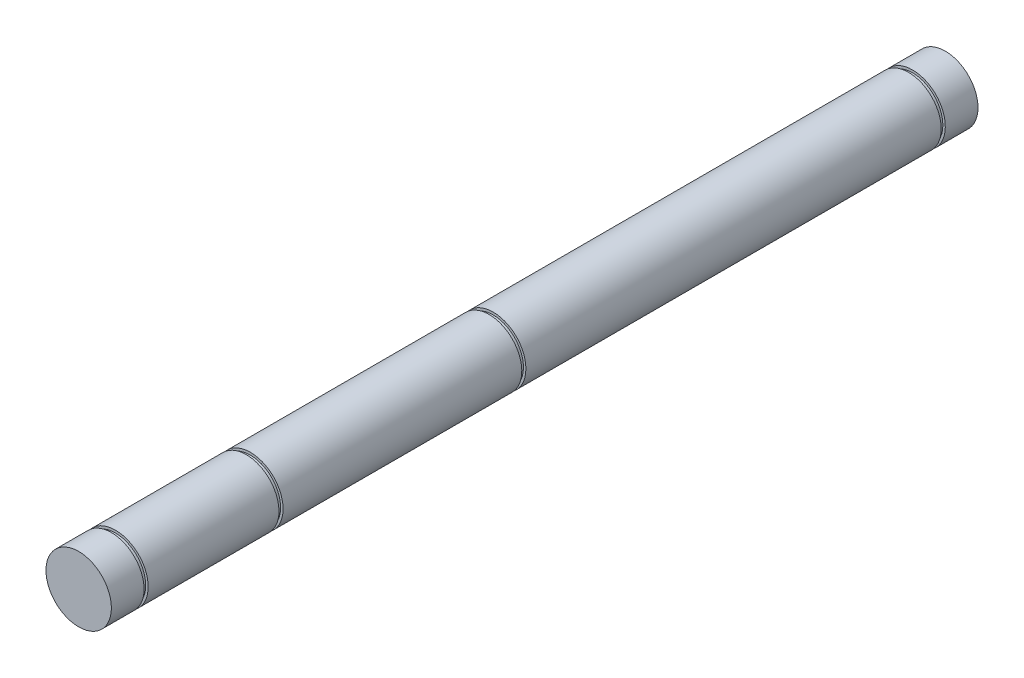
ISO-10303-21;
HEADER;
FILE_DESCRIPTION(('STEP AP214'),'2;1');
FILE_NAME('part.step','',(''),(''),'','','');
FILE_SCHEMA(('AUTOMOTIVE_DESIGN { 1 0 10303 214 1 1 1 1 }'));
ENDSEC;
DATA;
#1=APPLICATION_CONTEXT('core data for automotive mechanical design processes');
#2=APPLICATION_PROTOCOL_DEFINITION('international standard','automotive_design',2000,#1);
#3=PRODUCT_CONTEXT('',#1,'mechanical');
#4=PRODUCT('Part','Part','',(#3));
#5=PRODUCT_RELATED_PRODUCT_CATEGORY('part','',(#4));
#6=PRODUCT_DEFINITION_FORMATION('','',#4);
#7=PRODUCT_DEFINITION_CONTEXT('part definition',#1,'design');
#8=PRODUCT_DEFINITION('design','',#6,#7);
#9=PRODUCT_DEFINITION_SHAPE('','',#8);
#10=(LENGTH_UNIT() NAMED_UNIT(*) SI_UNIT(.MILLI.,.METRE.));
#11=(NAMED_UNIT(*) PLANE_ANGLE_UNIT() SI_UNIT($,.RADIAN.));
#12=(NAMED_UNIT(*) SI_UNIT($,.STERADIAN.) SOLID_ANGLE_UNIT());
#13=UNCERTAINTY_MEASURE_WITH_UNIT(LENGTH_MEASURE(1.E-05),#10,'distance_accuracy_value','');
#14=(GEOMETRIC_REPRESENTATION_CONTEXT(3) GLOBAL_UNCERTAINTY_ASSIGNED_CONTEXT((#13)) GLOBAL_UNIT_ASSIGNED_CONTEXT((#10,
#11,#12)) REPRESENTATION_CONTEXT('',''));
#15=CARTESIAN_POINT('',(0.,0.,0.));
#16=DIRECTION('',(0.,0.,1.));
#17=DIRECTION('',(1.,0.,0.));
#18=AXIS2_PLACEMENT_3D('',#15,#16,#17);
#19=CARTESIAN_POINT('',(7.32747196252603E-12,3.10862446895044E-12,53.0000000000001));
#20=DIRECTION('',(0.,0.,-1.));
#21=DIRECTION('',(-1.00000000000002,0.,0.));
#22=AXIS2_PLACEMENT_3D('',#19,#20,#21);
#23=CYLINDRICAL_SURFACE('',#22,2.);
#24=CARTESIAN_POINT('',(0.,0.,2.00000000000009));
#25=DIRECTION('',(0.,0.,-1.));
#26=DIRECTION('',(0.,1.00000000000002,0.));
#27=AXIS2_PLACEMENT_3D('',#24,#25,#26);
#28=CIRCLE('',#27,2.);
#29=CARTESIAN_POINT('',(0.,2.00000000000004,2.00000000000008));
#30=VERTEX_POINT('',#29);
#31=EDGE_CURVE('E36',#30,#30,#28,.T.);
#32=ORIENTED_EDGE('',*,*,#31,.T.);
#33=EDGE_LOOP('',(#32));
#34=FACE_BOUND('',#33,.T.);
#35=CARTESIAN_POINT('',(0.,0.,0.));
#36=DIRECTION('',(0.,0.,1.));
#37=DIRECTION('',(1.00000000000002,0.,0.));
#38=AXIS2_PLACEMENT_3D('',#35,#36,#37);
#39=CIRCLE('',#38,2.);
#40=CARTESIAN_POINT('',(2.00000000000004,0.,0.));
#41=VERTEX_POINT('',#40);
#42=EDGE_CURVE('E40',#41,#41,#39,.T.);
#43=ORIENTED_EDGE('',*,*,#42,.T.);
#44=EDGE_LOOP('',(#43));
#45=FACE_BOUND('',#44,.T.);
#46=ADVANCED_FACE('F32',(#34,#45),#23,.T.);
#47=CARTESIAN_POINT('',(0.,0.,0.));
#48=DIRECTION('',(0.,0.,1.));
#49=DIRECTION('',(1.00000000000002,0.,0.));
#50=AXIS2_PLACEMENT_3D('',#47,#48,#49);
#51=PLANE('',#50);
#52=ORIENTED_EDGE('',*,*,#42,.F.);
#53=EDGE_LOOP('',(#52));
#54=FACE_BOUND('',#53,.T.);
#55=ADVANCED_FACE('F80',(#54),#51,.F.);
#56=CARTESIAN_POINT('',(2.22044604925031E-12,3.8500000000028,2.00000000000014));
#57=DIRECTION('',(0.,0.,-1.));
#58=DIRECTION('',(0.,1.00000000000002,0.));
#59=AXIS2_PLACEMENT_3D('',#56,#57,#58);
#60=PLANE('',#59);
#61=CARTESIAN_POINT('',(0.,0.,2.00000000000009));
#62=DIRECTION('',(0.,0.,-1.));
#63=DIRECTION('',(0.,1.00000000000002,0.));
#64=AXIS2_PLACEMENT_3D('',#61,#62,#63);
#65=CIRCLE('',#64,1.84999999999999);
#66=CARTESIAN_POINT('',(0.,1.85000000000003,2.00000000000008));
#67=VERTEX_POINT('',#66);
#68=EDGE_CURVE('E54',#67,#67,#65,.T.);
#69=ORIENTED_EDGE('',*,*,#68,.T.);
#70=EDGE_LOOP('',(#69));
#71=FACE_BOUND('',#70,.T.);
#72=ORIENTED_EDGE('',*,*,#31,.F.);
#73=EDGE_LOOP('',(#72));
#74=FACE_BOUND('',#73,.T.);
#75=ADVANCED_FACE('F77',(#71,#74),#60,.F.);
#76=CARTESIAN_POINT('',(2.22044604925031E-12,3.8500000000028,2.25000000000017));
#77=DIRECTION('',(0.,0.,1.));
#78=DIRECTION('',(0.,-1.00000000000002,0.));
#79=AXIS2_PLACEMENT_3D('',#76,#77,#78);
#80=PLANE('',#79);
#81=CARTESIAN_POINT('',(0.,0.,2.25000000000011));
#82=DIRECTION('',(0.,0.,-1.));
#83=DIRECTION('',(0.,1.00000000000002,0.));
#84=AXIS2_PLACEMENT_3D('',#81,#82,#83);
#85=CIRCLE('',#84,1.84999999999999);
#86=CARTESIAN_POINT('',(0.,1.85000000000003,2.25000000000011));
#87=VERTEX_POINT('',#86);
#88=EDGE_CURVE('E181',#87,#87,#85,.T.);
#89=ORIENTED_EDGE('',*,*,#88,.F.);
#90=EDGE_LOOP('',(#89));
#91=FACE_BOUND('',#90,.T.);
#92=CARTESIAN_POINT('',(0.,0.,2.25000000000011));
#93=DIRECTION('',(0.,0.,1.));
#94=DIRECTION('',(0.,-1.00000000000002,0.));
#95=AXIS2_PLACEMENT_3D('',#92,#93,#94);
#96=CIRCLE('',#95,2.);
#97=CARTESIAN_POINT('',(0.,-2.00000000000004,2.25000000000011));
#98=VERTEX_POINT('',#97);
#99=EDGE_CURVE('E68',#98,#98,#96,.T.);
#100=ORIENTED_EDGE('',*,*,#99,.F.);
#101=EDGE_LOOP('',(#100));
#102=FACE_BOUND('',#101,.T.);
#103=ADVANCED_FACE('F79',(#91,#102),#80,.F.);
#104=CARTESIAN_POINT('',(0.,0.,0.));
#105=DIRECTION('',(0.,0.,-1.));
#106=DIRECTION('',(0.,1.00000000000002,0.));
#107=AXIS2_PLACEMENT_3D('',#104,#105,#106);
#108=CYLINDRICAL_SURFACE('',#107,1.84999999999999);
#109=ORIENTED_EDGE('',*,*,#68,.F.);
#110=EDGE_LOOP('',(#109));
#111=FACE_BOUND('',#110,.T.);
#112=ORIENTED_EDGE('',*,*,#88,.T.);
#113=EDGE_LOOP('',(#112));
#114=FACE_BOUND('',#113,.T.);
#115=ADVANCED_FACE('F87',(#111,#114),#108,.T.);
#116=ORIENTED_EDGE('',*,*,#99,.T.);
#117=EDGE_LOOP('',(#116));
#118=FACE_BOUND('',#117,.T.);
#119=CARTESIAN_POINT('',(0.,0.,27.6500000000001));
#120=DIRECTION('',(0.,0.,-1.));
#121=DIRECTION('',(0.,1.00000000000002,0.));
#122=AXIS2_PLACEMENT_3D('',#119,#120,#121);
#123=CIRCLE('',#122,2.);
#124=CARTESIAN_POINT('',(0.,2.00000000000004,27.6500000000001));
#125=VERTEX_POINT('',#124);
#126=EDGE_CURVE('E57',#125,#125,#123,.T.);
#127=ORIENTED_EDGE('',*,*,#126,.T.);
#128=EDGE_LOOP('',(#127));
#129=FACE_BOUND('',#128,.T.);
#130=ADVANCED_FACE('F106',(#118,#129),#23,.T.);
#131=CARTESIAN_POINT('',(1.33226762955019E-12,3.85000000000207,27.9000000000001));
#132=DIRECTION('',(0.,0.,1.));
#133=DIRECTION('',(0.,-1.00000000000002,0.));
#134=AXIS2_PLACEMENT_3D('',#131,#132,#133);
#135=PLANE('',#134);
#136=CARTESIAN_POINT('',(0.,0.,27.9000000000001));
#137=DIRECTION('',(0.,0.,-1.));
#138=DIRECTION('',(0.,1.00000000000002,0.));
#139=AXIS2_PLACEMENT_3D('',#136,#137,#138);
#140=CIRCLE('',#139,1.84999999999995);
#141=CARTESIAN_POINT('',(0.,1.84999999999999,27.9000000000001));
#142=VERTEX_POINT('',#141);
#143=EDGE_CURVE('E47',#142,#142,#140,.T.);
#144=ORIENTED_EDGE('',*,*,#143,.F.);
#145=EDGE_LOOP('',(#144));
#146=FACE_BOUND('',#145,.T.);
#147=CARTESIAN_POINT('',(0.,0.,27.9000000000001));
#148=DIRECTION('',(0.,0.,1.));
#149=DIRECTION('',(0.,-1.00000000000002,0.));
#150=AXIS2_PLACEMENT_3D('',#147,#148,#149);
#151=CIRCLE('',#150,2.);
#152=CARTESIAN_POINT('',(0.,-2.00000000000004,27.9000000000001));
#153=VERTEX_POINT('',#152);
#154=EDGE_CURVE('E60',#153,#153,#151,.T.);
#155=ORIENTED_EDGE('',*,*,#154,.F.);
#156=EDGE_LOOP('',(#155));
#157=FACE_BOUND('',#156,.T.);
#158=ADVANCED_FACE('F114',(#146,#157),#135,.F.);
#159=CARTESIAN_POINT('',(1.33226762955019E-12,3.85000000000207,27.6500000000001));
#160=DIRECTION('',(0.,0.,-1.));
#161=DIRECTION('',(0.,1.00000000000002,0.));
#162=AXIS2_PLACEMENT_3D('',#159,#160,#161);
#163=PLANE('',#162);
#164=CARTESIAN_POINT('',(0.,0.,27.6500000000001));
#165=DIRECTION('',(0.,0.,-1.));
#166=DIRECTION('',(0.,1.00000000000002,0.));
#167=AXIS2_PLACEMENT_3D('',#164,#165,#166);
#168=CIRCLE('',#167,1.84999999999995);
#169=CARTESIAN_POINT('',(0.,1.84999999999999,27.6500000000001));
#170=VERTEX_POINT('',#169);
#171=EDGE_CURVE('E168',#170,#170,#168,.T.);
#172=ORIENTED_EDGE('',*,*,#171,.T.);
#173=EDGE_LOOP('',(#172));
#174=FACE_BOUND('',#173,.T.);
#175=ORIENTED_EDGE('',*,*,#126,.F.);
#176=EDGE_LOOP('',(#175));
#177=FACE_BOUND('',#176,.T.);
#178=ADVANCED_FACE('F119',(#174,#177),#163,.F.);
#179=CARTESIAN_POINT('',(0.,0.,0.));
#180=DIRECTION('',(0.,0.,-1.));
#181=DIRECTION('',(0.,1.00000000000002,0.));
#182=AXIS2_PLACEMENT_3D('',#179,#180,#181);
#183=CYLINDRICAL_SURFACE('',#182,1.84999999999995);
#184=ORIENTED_EDGE('',*,*,#171,.F.);
#185=EDGE_LOOP('',(#184));
#186=FACE_BOUND('',#185,.T.);
#187=ORIENTED_EDGE('',*,*,#143,.T.);
#188=EDGE_LOOP('',(#187));
#189=FACE_BOUND('',#188,.T.);
#190=ADVANCED_FACE('F100',(#186,#189),#183,.T.);
#191=CARTESIAN_POINT('',(5.99520433297585E-12,1.77635683940025E-12,42.5000000000001));
#192=DIRECTION('',(0.,0.,-1.));
#193=DIRECTION('',(0.,1.00000000000002,0.));
#194=AXIS2_PLACEMENT_3D('',#191,#192,#193);
#195=CIRCLE('',#194,2.);
#196=CARTESIAN_POINT('',(5.99487126606846E-12,2.00000000000181,42.5000000000001));
#197=VERTEX_POINT('',#196);
#198=EDGE_CURVE('E66',#197,#197,#195,.T.);
#199=ORIENTED_EDGE('',*,*,#198,.T.);
#200=EDGE_LOOP('',(#199));
#201=FACE_BOUND('',#200,.T.);
#202=ORIENTED_EDGE('',*,*,#154,.T.);
#203=EDGE_LOOP('',(#202));
#204=FACE_BOUND('',#203,.T.);
#205=ADVANCED_FACE('F95',(#201,#204),#23,.T.);
#206=CARTESIAN_POINT('',(5.21804821573824E-12,3.85000000000185,42.5000000000001));
#207=DIRECTION('',(0.,0.,-1.));
#208=DIRECTION('',(0.,1.00000000000002,0.));
#209=AXIS2_PLACEMENT_3D('',#206,#207,#208);
#210=PLANE('',#209);
#211=CARTESIAN_POINT('',(5.99520433297585E-12,1.77635683940025E-12,42.5000000000001));
#212=DIRECTION('',(0.,0.,-1.));
#213=DIRECTION('',(0.,1.00000000000002,0.));
#214=AXIS2_PLACEMENT_3D('',#211,#212,#213);
#215=CIRCLE('',#214,1.84999999999998);
#216=CARTESIAN_POINT('',(5.99489624608651E-12,1.85000000000179,42.5000000000001));
#217=VERTEX_POINT('',#216);
#218=EDGE_CURVE('E175',#217,#217,#215,.T.);
#219=ORIENTED_EDGE('',*,*,#218,.T.);
#220=EDGE_LOOP('',(#219));
#221=FACE_BOUND('',#220,.T.);
#222=ORIENTED_EDGE('',*,*,#198,.F.);
#223=EDGE_LOOP('',(#222));
#224=FACE_BOUND('',#223,.T.);
#225=ADVANCED_FACE('F99',(#221,#224),#210,.F.);
#226=CARTESIAN_POINT('',(5.21804821573824E-12,3.85000000000185,42.7500000000001));
#227=DIRECTION('',(0.,0.,1.));
#228=DIRECTION('',(0.,-1.00000000000002,0.));
#229=AXIS2_PLACEMENT_3D('',#226,#227,#228);
#230=PLANE('',#229);
#231=CARTESIAN_POINT('',(5.99520433297585E-12,1.77635683940025E-12,42.7500000000001));
#232=DIRECTION('',(0.,0.,-1.));
#233=DIRECTION('',(0.,1.00000000000002,0.));
#234=AXIS2_PLACEMENT_3D('',#231,#232,#233);
#235=CIRCLE('',#234,1.84999999999998);
#236=CARTESIAN_POINT('',(5.99489624608651E-12,1.85000000000179,42.7500000000001));
#237=VERTEX_POINT('',#236);
#238=EDGE_CURVE('E177',#237,#237,#235,.T.);
#239=ORIENTED_EDGE('',*,*,#238,.F.);
#240=EDGE_LOOP('',(#239));
#241=FACE_BOUND('',#240,.T.);
#242=CARTESIAN_POINT('',(5.99520433297585E-12,1.77635683940025E-12,42.7500000000001));
#243=DIRECTION('',(0.,0.,1.));
#244=DIRECTION('',(0.,-1.00000000000002,0.));
#245=AXIS2_PLACEMENT_3D('',#242,#243,#244);
#246=CIRCLE('',#245,2.);
#247=CARTESIAN_POINT('',(5.99553739988323E-12,-1.99999999999826,42.7500000000001));
#248=VERTEX_POINT('',#247);
#249=EDGE_CURVE('E63',#248,#248,#246,.T.);
#250=ORIENTED_EDGE('',*,*,#249,.F.);
#251=EDGE_LOOP('',(#250));
#252=FACE_BOUND('',#251,.T.);
#253=ADVANCED_FACE('F135',(#241,#252),#230,.F.);
#254=CARTESIAN_POINT('',(0.,0.,0.));
#255=DIRECTION('',(0.,0.,-1.));
#256=DIRECTION('',(0.,1.00000000000002,0.));
#257=AXIS2_PLACEMENT_3D('',#254,#255,#256);
#258=CYLINDRICAL_SURFACE('',#257,1.84999999999998);
#259=ORIENTED_EDGE('',*,*,#218,.F.);
#260=EDGE_LOOP('',(#259));
#261=FACE_BOUND('',#260,.T.);
#262=ORIENTED_EDGE('',*,*,#238,.T.);
#263=EDGE_LOOP('',(#262));
#264=FACE_BOUND('',#263,.T.);
#265=ADVANCED_FACE('F126',(#261,#264),#258,.T.);
#266=ORIENTED_EDGE('',*,*,#249,.T.);
#267=EDGE_LOOP('',(#266));
#268=FACE_BOUND('',#267,.T.);
#269=CARTESIAN_POINT('',(7.32747196252603E-12,3.10862446895044E-12,50.7500000000001));
#270=DIRECTION('',(0.,0.,-1.));
#271=DIRECTION('',(0.,1.00000000000002,0.));
#272=AXIS2_PLACEMENT_3D('',#269,#270,#271);
#273=CIRCLE('',#272,2.);
#274=CARTESIAN_POINT('',(7.32713889561865E-12,2.00000000000315,50.7500000000001));
#275=VERTEX_POINT('',#274);
#276=EDGE_CURVE('E53',#275,#275,#273,.T.);
#277=ORIENTED_EDGE('',*,*,#276,.T.);
#278=EDGE_LOOP('',(#277));
#279=FACE_BOUND('',#278,.T.);
#280=ADVANCED_FACE('F102',(#268,#279),#23,.T.);
#281=CARTESIAN_POINT('',(5.55111512312578E-12,3.85000000000291,50.7500000000001));
#282=DIRECTION('',(0.,0.,-1.));
#283=DIRECTION('',(0.,1.00000000000002,0.));
#284=AXIS2_PLACEMENT_3D('',#281,#282,#283);
#285=PLANE('',#284);
#286=CARTESIAN_POINT('',(7.32747196252603E-12,3.10862446895044E-12,50.7500000000001));
#287=DIRECTION('',(0.,0.,-1.));
#288=DIRECTION('',(0.,1.00000000000002,0.));
#289=AXIS2_PLACEMENT_3D('',#286,#287,#288);
#290=CIRCLE('',#289,1.84999999999998);
#291=CARTESIAN_POINT('',(7.3271638756367E-12,1.85000000000312,50.7500000000001));
#292=VERTEX_POINT('',#291);
#293=EDGE_CURVE('E173',#292,#292,#290,.T.);
#294=ORIENTED_EDGE('',*,*,#293,.T.);
#295=EDGE_LOOP('',(#294));
#296=FACE_BOUND('',#295,.T.);
#297=ORIENTED_EDGE('',*,*,#276,.F.);
#298=EDGE_LOOP('',(#297));
#299=FACE_BOUND('',#298,.T.);
#300=ADVANCED_FACE('F125',(#296,#299),#285,.F.);
#301=CARTESIAN_POINT('',(5.55111512312578E-12,3.85000000000291,51.0000000000001));
#302=DIRECTION('',(0.,0.,1.));
#303=DIRECTION('',(0.,-1.00000000000002,0.));
#304=AXIS2_PLACEMENT_3D('',#301,#302,#303);
#305=PLANE('',#304);
#306=CARTESIAN_POINT('',(7.32747196252603E-12,3.10862446895044E-12,51.0000000000001));
#307=DIRECTION('',(0.,0.,-1.));
#308=DIRECTION('',(0.,1.00000000000002,0.));
#309=AXIS2_PLACEMENT_3D('',#306,#307,#308);
#310=CIRCLE('',#309,1.84999999999998);
#311=CARTESIAN_POINT('',(7.3271638756367E-12,1.85000000000312,51.0000000000001));
#312=VERTEX_POINT('',#311);
#313=EDGE_CURVE('E171',#312,#312,#310,.T.);
#314=ORIENTED_EDGE('',*,*,#313,.F.);
#315=EDGE_LOOP('',(#314));
#316=FACE_BOUND('',#315,.T.);
#317=CARTESIAN_POINT('',(7.32747196252603E-12,3.10862446895044E-12,51.0000000000001));
#318=DIRECTION('',(0.,0.,1.));
#319=DIRECTION('',(0.,-1.00000000000002,0.));
#320=AXIS2_PLACEMENT_3D('',#317,#318,#319);
#321=CIRCLE('',#320,2.);
#322=CARTESIAN_POINT('',(7.32780502943342E-12,-1.99999999999693,51.0000000000001));
#323=VERTEX_POINT('',#322);
#324=EDGE_CURVE('E50',#323,#323,#321,.T.);
#325=ORIENTED_EDGE('',*,*,#324,.F.);
#326=EDGE_LOOP('',(#325));
#327=FACE_BOUND('',#326,.T.);
#328=ADVANCED_FACE('F132',(#316,#327),#305,.F.);
#329=CARTESIAN_POINT('',(0.,0.,0.));
#330=DIRECTION('',(0.,0.,-1.));
#331=DIRECTION('',(0.,1.00000000000002,0.));
#332=AXIS2_PLACEMENT_3D('',#329,#330,#331);
#333=CYLINDRICAL_SURFACE('',#332,1.84999999999998);
#334=ORIENTED_EDGE('',*,*,#293,.F.);
#335=EDGE_LOOP('',(#334));
#336=FACE_BOUND('',#335,.T.);
#337=ORIENTED_EDGE('',*,*,#313,.T.);
#338=EDGE_LOOP('',(#337));
#339=FACE_BOUND('',#338,.T.);
#340=ADVANCED_FACE('F110',(#336,#339),#333,.T.);
#341=CARTESIAN_POINT('',(7.32747196252603E-12,3.10862446895044E-12,53.0000000000001));
#342=DIRECTION('',(0.,0.,1.));
#343=DIRECTION('',(1.00000000000002,0.,0.));
#344=AXIS2_PLACEMENT_3D('',#341,#342,#343);
#345=PLANE('',#344);
#346=CARTESIAN_POINT('',(7.32747196252603E-12,3.10862446895044E-12,53.0000000000001));
#347=DIRECTION('',(0.,0.,1.));
#348=DIRECTION('',(1.00000000000002,0.,0.));
#349=AXIS2_PLACEMENT_3D('',#346,#347,#348);
#350=CIRCLE('',#349,2.);
#351=CARTESIAN_POINT('',(2.00000000000737,3.10895753585783E-12,53.0000000000001));
#352=VERTEX_POINT('',#351);
#353=EDGE_CURVE('E10',#352,#352,#350,.T.);
#354=ORIENTED_EDGE('',*,*,#353,.T.);
#355=EDGE_LOOP('',(#354));
#356=FACE_BOUND('',#355,.T.);
#357=ADVANCED_FACE('F104',(#356),#345,.T.);
#358=ORIENTED_EDGE('',*,*,#324,.T.);
#359=EDGE_LOOP('',(#358));
#360=FACE_BOUND('',#359,.T.);
#361=ORIENTED_EDGE('',*,*,#353,.F.);
#362=EDGE_LOOP('',(#361));
#363=FACE_BOUND('',#362,.T.);
#364=ADVANCED_FACE('F34',(#360,#363),#23,.T.);
#365=CLOSED_SHELL('',(#46,#55,#75,#103,#115,#130,#158,#178,#190,#205,#225,#253,#265,#280,#300,
#328,#340,#357,#364));
#366=MANIFOLD_SOLID_BREP('B2',#365);
#367=ADVANCED_BREP_SHAPE_REPRESENTATION('',(#18,#366),#14);
#368=SHAPE_DEFINITION_REPRESENTATION(#9,#367);
ENDSEC;
END-ISO-10303-21;
